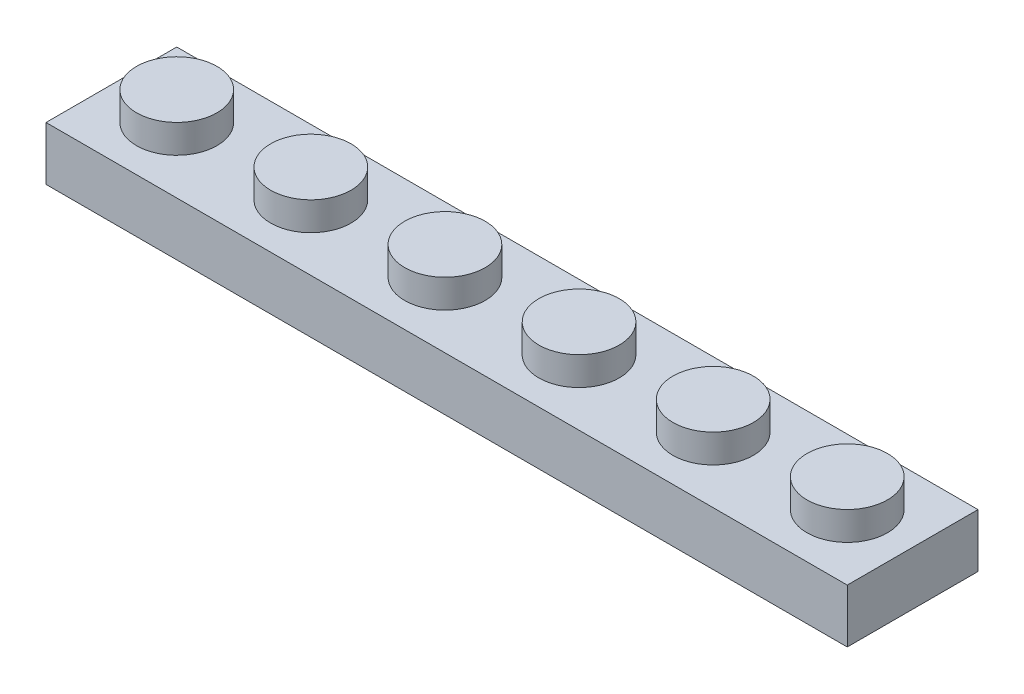
ISO-10303-21;
HEADER;
FILE_DESCRIPTION(('STEP AP214'),'2;1');
FILE_NAME('part.step','',(''),(''),'','','');
FILE_SCHEMA(('AUTOMOTIVE_DESIGN { 1 0 10303 214 1 1 1 1 }'));
ENDSEC;
DATA;
#1=APPLICATION_CONTEXT('core data for automotive mechanical design processes');
#2=APPLICATION_PROTOCOL_DEFINITION('international standard','automotive_design',2000,#1);
#3=PRODUCT_CONTEXT('',#1,'mechanical');
#4=PRODUCT('Part','Part','',(#3));
#5=PRODUCT_RELATED_PRODUCT_CATEGORY('part','',(#4));
#6=PRODUCT_DEFINITION_FORMATION('','',#4);
#7=PRODUCT_DEFINITION_CONTEXT('part definition',#1,'design');
#8=PRODUCT_DEFINITION('design','',#6,#7);
#9=PRODUCT_DEFINITION_SHAPE('','',#8);
#10=(LENGTH_UNIT() NAMED_UNIT(*) SI_UNIT(.MILLI.,.METRE.));
#11=(NAMED_UNIT(*) PLANE_ANGLE_UNIT() SI_UNIT($,.RADIAN.));
#12=(NAMED_UNIT(*) SI_UNIT($,.STERADIAN.) SOLID_ANGLE_UNIT());
#13=UNCERTAINTY_MEASURE_WITH_UNIT(LENGTH_MEASURE(1.E-05),#10,'distance_accuracy_value','');
#14=(GEOMETRIC_REPRESENTATION_CONTEXT(3) GLOBAL_UNCERTAINTY_ASSIGNED_CONTEXT((#13)) GLOBAL_UNIT_ASSIGNED_CONTEXT((#10,
#11,#12)) REPRESENTATION_CONTEXT('',''));
#15=CARTESIAN_POINT('',(0.,0.,0.));
#16=DIRECTION('',(0.,0.,1.));
#17=DIRECTION('',(1.,0.,0.));
#18=AXIS2_PLACEMENT_3D('',#15,#16,#17);
#19=CARTESIAN_POINT('',(-23.9,3.2,3.9));
#20=DIRECTION('',(1.,0.,0.));
#21=DIRECTION('',(0.,0.,-1.));
#22=AXIS2_PLACEMENT_3D('',#19,#20,#21);
#23=PLANE('',#22);
#24=DIRECTION('',(0.,0.,1.));
#25=VECTOR('',#24,1.);
#26=CARTESIAN_POINT('',(-23.9,0.,3.9));
#27=LINE('',#26,#25);
#28=CARTESIAN_POINT('',(-23.9,0.,-3.9));
#29=VERTEX_POINT('',#28);
#30=CARTESIAN_POINT('',(-23.9,0.,3.9));
#31=VERTEX_POINT('',#30);
#32=EDGE_CURVE('E96',#29,#31,#27,.T.);
#33=ORIENTED_EDGE('',*,*,#32,.T.);
#34=DIRECTION('',(0.,-1.,0.));
#35=VECTOR('',#34,1.);
#36=CARTESIAN_POINT('',(-23.9,3.2,3.9));
#37=LINE('',#36,#35);
#38=CARTESIAN_POINT('',(-23.9,3.2,3.9));
#39=VERTEX_POINT('',#38);
#40=EDGE_CURVE('E11',#39,#31,#37,.T.);
#41=ORIENTED_EDGE('',*,*,#40,.F.);
#42=DIRECTION('',(0.,0.,1.));
#43=VECTOR('',#42,1.);
#44=CARTESIAN_POINT('',(-23.9,3.2,3.9));
#45=LINE('',#44,#43);
#46=CARTESIAN_POINT('',(-23.9,3.2,-3.9));
#47=VERTEX_POINT('',#46);
#48=EDGE_CURVE('E84',#47,#39,#45,.T.);
#49=ORIENTED_EDGE('',*,*,#48,.F.);
#50=DIRECTION('',(0.,-1.,0.));
#51=VECTOR('',#50,1.);
#52=CARTESIAN_POINT('',(-23.9,3.2,-3.9));
#53=LINE('',#52,#51);
#54=EDGE_CURVE('E92',#47,#29,#53,.T.);
#55=ORIENTED_EDGE('',*,*,#54,.T.);
#56=EDGE_LOOP('',(#33,#41,#49,#55));
#57=FACE_BOUND('',#56,.T.);
#58=ADVANCED_FACE('F33',(#57),#23,.F.);
#59=CARTESIAN_POINT('',(23.9,3.2,3.9));
#60=DIRECTION('',(0.,0.,-1.));
#61=DIRECTION('',(-1.,0.,0.));
#62=AXIS2_PLACEMENT_3D('',#59,#60,#61);
#63=PLANE('',#62);
#64=DIRECTION('',(1.,0.,0.));
#65=VECTOR('',#64,1.);
#66=CARTESIAN_POINT('',(23.9,0.,3.9));
#67=LINE('',#66,#65);
#68=CARTESIAN_POINT('',(23.9,0.,3.9));
#69=VERTEX_POINT('',#68);
#70=EDGE_CURVE('E88',#31,#69,#67,.T.);
#71=ORIENTED_EDGE('',*,*,#70,.T.);
#72=DIRECTION('',(0.,-1.,0.));
#73=VECTOR('',#72,1.);
#74=CARTESIAN_POINT('',(23.9,3.2,3.9));
#75=LINE('',#74,#73);
#76=CARTESIAN_POINT('',(23.9,3.2,3.9));
#77=VERTEX_POINT('',#76);
#78=EDGE_CURVE('E41',#77,#69,#75,.T.);
#79=ORIENTED_EDGE('',*,*,#78,.F.);
#80=DIRECTION('',(1.,0.,0.));
#81=VECTOR('',#80,1.);
#82=CARTESIAN_POINT('',(23.9,3.2,3.9));
#83=LINE('',#82,#81);
#84=EDGE_CURVE('E79',#39,#77,#83,.T.);
#85=ORIENTED_EDGE('',*,*,#84,.F.);
#86=ORIENTED_EDGE('',*,*,#40,.T.);
#87=EDGE_LOOP('',(#71,#79,#85,#86));
#88=FACE_BOUND('',#87,.T.);
#89=ADVANCED_FACE('F87',(#88),#63,.F.);
#90=CARTESIAN_POINT('',(23.9,3.2,3.9));
#91=DIRECTION('',(-1.,0.,0.));
#92=DIRECTION('',(0.,0.,1.));
#93=AXIS2_PLACEMENT_3D('',#90,#91,#92);
#94=PLANE('',#93);
#95=DIRECTION('',(0.,0.,-1.));
#96=VECTOR('',#95,1.);
#97=CARTESIAN_POINT('',(23.9,0.,3.9));
#98=LINE('',#97,#96);
#99=CARTESIAN_POINT('',(23.9,0.,-3.90000000000001));
#100=VERTEX_POINT('',#99);
#101=EDGE_CURVE('E66',#69,#100,#98,.T.);
#102=ORIENTED_EDGE('',*,*,#101,.T.);
#103=DIRECTION('',(0.,-1.,0.));
#104=VECTOR('',#103,1.);
#105=CARTESIAN_POINT('',(23.9,3.2,-3.90000000000001));
#106=LINE('',#105,#104);
#107=CARTESIAN_POINT('',(23.9,3.2,-3.90000000000001));
#108=VERTEX_POINT('',#107);
#109=EDGE_CURVE('E89',#108,#100,#106,.T.);
#110=ORIENTED_EDGE('',*,*,#109,.F.);
#111=DIRECTION('',(0.,0.,-1.));
#112=VECTOR('',#111,1.);
#113=CARTESIAN_POINT('',(23.9,3.2,3.9));
#114=LINE('',#113,#112);
#115=EDGE_CURVE('E82',#77,#108,#114,.T.);
#116=ORIENTED_EDGE('',*,*,#115,.F.);
#117=ORIENTED_EDGE('',*,*,#78,.T.);
#118=EDGE_LOOP('',(#102,#110,#116,#117));
#119=FACE_BOUND('',#118,.T.);
#120=ADVANCED_FACE('F90',(#119),#94,.F.);
#121=CARTESIAN_POINT('',(23.9,3.2,-3.90000000000001));
#122=DIRECTION('',(0.,0.,1.));
#123=DIRECTION('',(1.,0.,0.));
#124=AXIS2_PLACEMENT_3D('',#121,#122,#123);
#125=PLANE('',#124);
#126=DIRECTION('',(-1.,0.,0.));
#127=VECTOR('',#126,1.);
#128=CARTESIAN_POINT('',(23.9,0.,-3.90000000000001));
#129=LINE('',#128,#127);
#130=EDGE_CURVE('E72',#100,#29,#129,.T.);
#131=ORIENTED_EDGE('',*,*,#130,.T.);
#132=ORIENTED_EDGE('',*,*,#54,.F.);
#133=DIRECTION('',(-1.,0.,0.));
#134=VECTOR('',#133,1.);
#135=CARTESIAN_POINT('',(23.9,3.2,-3.90000000000001));
#136=LINE('',#135,#134);
#137=EDGE_CURVE('E49',#108,#47,#136,.T.);
#138=ORIENTED_EDGE('',*,*,#137,.F.);
#139=ORIENTED_EDGE('',*,*,#109,.T.);
#140=EDGE_LOOP('',(#131,#132,#138,#139));
#141=FACE_BOUND('',#140,.T.);
#142=ADVANCED_FACE('F104',(#141),#125,.F.);
#143=CARTESIAN_POINT('',(0.,3.2,0.));
#144=DIRECTION('',(0.,1.,0.));
#145=DIRECTION('',(0.,0.,1.));
#146=AXIS2_PLACEMENT_3D('',#143,#144,#145);
#147=PLANE('',#146);
#148=CARTESIAN_POINT('',(20.,3.2,0.));
#149=DIRECTION('',(0.,1.,0.));
#150=DIRECTION('',(0.,0.,1.));
#151=AXIS2_PLACEMENT_3D('',#148,#149,#150);
#152=CIRCLE('',#151,2.4);
#153=CARTESIAN_POINT('',(20.,3.2,2.39999999999999));
#154=VERTEX_POINT('',#153);
#155=EDGE_CURVE('E140',#154,#154,#152,.T.);
#156=ORIENTED_EDGE('',*,*,#155,.F.);
#157=EDGE_LOOP('',(#156));
#158=FACE_BOUND('',#157,.T.);
#159=CARTESIAN_POINT('',(12.,3.2,0.));
#160=DIRECTION('',(0.,1.,0.));
#161=DIRECTION('',(0.,0.,1.));
#162=AXIS2_PLACEMENT_3D('',#159,#160,#161);
#163=CIRCLE('',#162,2.4);
#164=CARTESIAN_POINT('',(12.,3.2,2.39999999999999));
#165=VERTEX_POINT('',#164);
#166=EDGE_CURVE('E134',#165,#165,#163,.T.);
#167=ORIENTED_EDGE('',*,*,#166,.F.);
#168=EDGE_LOOP('',(#167));
#169=FACE_BOUND('',#168,.T.);
#170=CARTESIAN_POINT('',(4.00000000000001,3.2,0.));
#171=DIRECTION('',(0.,1.,0.));
#172=DIRECTION('',(0.,0.,1.));
#173=AXIS2_PLACEMENT_3D('',#170,#171,#172);
#174=CIRCLE('',#173,2.4);
#175=CARTESIAN_POINT('',(4.00000000000001,3.2,2.39999999999999));
#176=VERTEX_POINT('',#175);
#177=EDGE_CURVE('E128',#176,#176,#174,.T.);
#178=ORIENTED_EDGE('',*,*,#177,.F.);
#179=EDGE_LOOP('',(#178));
#180=FACE_BOUND('',#179,.T.);
#181=CARTESIAN_POINT('',(-3.99999999999999,3.2,0.));
#182=DIRECTION('',(0.,1.,0.));
#183=DIRECTION('',(0.,0.,1.));
#184=AXIS2_PLACEMENT_3D('',#181,#182,#183);
#185=CIRCLE('',#184,2.4);
#186=CARTESIAN_POINT('',(-3.99999999999999,3.2,2.39999999999999));
#187=VERTEX_POINT('',#186);
#188=EDGE_CURVE('E122',#187,#187,#185,.T.);
#189=ORIENTED_EDGE('',*,*,#188,.F.);
#190=EDGE_LOOP('',(#189));
#191=FACE_BOUND('',#190,.T.);
#192=CARTESIAN_POINT('',(-12.,3.2,0.));
#193=DIRECTION('',(0.,1.,0.));
#194=DIRECTION('',(0.,0.,1.));
#195=AXIS2_PLACEMENT_3D('',#192,#193,#194);
#196=CIRCLE('',#195,2.4);
#197=CARTESIAN_POINT('',(-12.,3.2,2.39999999999999));
#198=VERTEX_POINT('',#197);
#199=EDGE_CURVE('E116',#198,#198,#196,.T.);
#200=ORIENTED_EDGE('',*,*,#199,.F.);
#201=EDGE_LOOP('',(#200));
#202=FACE_BOUND('',#201,.T.);
#203=CARTESIAN_POINT('',(-20.,3.2,0.));
#204=DIRECTION('',(0.,1.,0.));
#205=DIRECTION('',(0.,0.,1.));
#206=AXIS2_PLACEMENT_3D('',#203,#204,#205);
#207=CIRCLE('',#206,2.4);
#208=CARTESIAN_POINT('',(-20.,3.2,2.4));
#209=VERTEX_POINT('',#208);
#210=EDGE_CURVE('E110',#209,#209,#207,.T.);
#211=ORIENTED_EDGE('',*,*,#210,.F.);
#212=EDGE_LOOP('',(#211));
#213=FACE_BOUND('',#212,.T.);
#214=ORIENTED_EDGE('',*,*,#48,.T.);
#215=ORIENTED_EDGE('',*,*,#84,.T.);
#216=ORIENTED_EDGE('',*,*,#115,.T.);
#217=ORIENTED_EDGE('',*,*,#137,.T.);
#218=EDGE_LOOP('',(#214,#215,#216,#217));
#219=FACE_BOUND('',#218,.T.);
#220=ADVANCED_FACE('F80',(#158,#169,#180,#191,#202,#213,#219),#147,.T.);
#221=CARTESIAN_POINT('',(0.,0.,0.));
#222=DIRECTION('',(0.,1.,0.));
#223=DIRECTION('',(0.,0.,1.));
#224=AXIS2_PLACEMENT_3D('',#221,#222,#223);
#225=PLANE('',#224);
#226=CARTESIAN_POINT('',(-20.,0.,0.));
#227=DIRECTION('',(0.,-1.,0.));
#228=DIRECTION('',(0.,0.,-1.));
#229=AXIS2_PLACEMENT_3D('',#226,#227,#228);
#230=CIRCLE('',#229,2.5);
#231=CARTESIAN_POINT('',(-20.,0.,-2.5));
#232=VERTEX_POINT('',#231);
#233=EDGE_CURVE('E176',#232,#232,#230,.T.);
#234=ORIENTED_EDGE('',*,*,#233,.F.);
#235=EDGE_LOOP('',(#234));
#236=FACE_BOUND('',#235,.T.);
#237=CARTESIAN_POINT('',(-12.,0.,0.));
#238=DIRECTION('',(0.,-1.,0.));
#239=DIRECTION('',(0.,0.,-1.));
#240=AXIS2_PLACEMENT_3D('',#237,#238,#239);
#241=CIRCLE('',#240,2.5);
#242=CARTESIAN_POINT('',(-12.,0.,-2.5));
#243=VERTEX_POINT('',#242);
#244=EDGE_CURVE('E170',#243,#243,#241,.T.);
#245=ORIENTED_EDGE('',*,*,#244,.F.);
#246=EDGE_LOOP('',(#245));
#247=FACE_BOUND('',#246,.T.);
#248=CARTESIAN_POINT('',(-3.99999999999999,0.,0.));
#249=DIRECTION('',(0.,-1.,0.));
#250=DIRECTION('',(0.,0.,-1.));
#251=AXIS2_PLACEMENT_3D('',#248,#249,#250);
#252=CIRCLE('',#251,2.5);
#253=CARTESIAN_POINT('',(-3.99999999999999,0.,-2.5));
#254=VERTEX_POINT('',#253);
#255=EDGE_CURVE('E164',#254,#254,#252,.T.);
#256=ORIENTED_EDGE('',*,*,#255,.F.);
#257=EDGE_LOOP('',(#256));
#258=FACE_BOUND('',#257,.T.);
#259=CARTESIAN_POINT('',(4.00000000000001,0.,0.));
#260=DIRECTION('',(0.,-1.,0.));
#261=DIRECTION('',(0.,0.,-1.));
#262=AXIS2_PLACEMENT_3D('',#259,#260,#261);
#263=CIRCLE('',#262,2.5);
#264=CARTESIAN_POINT('',(4.00000000000001,0.,-2.5));
#265=VERTEX_POINT('',#264);
#266=EDGE_CURVE('E158',#265,#265,#263,.T.);
#267=ORIENTED_EDGE('',*,*,#266,.F.);
#268=EDGE_LOOP('',(#267));
#269=FACE_BOUND('',#268,.T.);
#270=CARTESIAN_POINT('',(12.,0.,0.));
#271=DIRECTION('',(0.,-1.,0.));
#272=DIRECTION('',(0.,0.,-1.));
#273=AXIS2_PLACEMENT_3D('',#270,#271,#272);
#274=CIRCLE('',#273,2.5);
#275=CARTESIAN_POINT('',(12.,0.,-2.5));
#276=VERTEX_POINT('',#275);
#277=EDGE_CURVE('E152',#276,#276,#274,.T.);
#278=ORIENTED_EDGE('',*,*,#277,.F.);
#279=EDGE_LOOP('',(#278));
#280=FACE_BOUND('',#279,.T.);
#281=CARTESIAN_POINT('',(20.,0.,0.));
#282=DIRECTION('',(0.,-1.,0.));
#283=DIRECTION('',(0.,0.,-1.));
#284=AXIS2_PLACEMENT_3D('',#281,#282,#283);
#285=CIRCLE('',#284,2.5);
#286=CARTESIAN_POINT('',(20.,0.,-2.5));
#287=VERTEX_POINT('',#286);
#288=EDGE_CURVE('E146',#287,#287,#285,.T.);
#289=ORIENTED_EDGE('',*,*,#288,.F.);
#290=EDGE_LOOP('',(#289));
#291=FACE_BOUND('',#290,.T.);
#292=ORIENTED_EDGE('',*,*,#32,.F.);
#293=ORIENTED_EDGE('',*,*,#130,.F.);
#294=ORIENTED_EDGE('',*,*,#101,.F.);
#295=ORIENTED_EDGE('',*,*,#70,.F.);
#296=EDGE_LOOP('',(#292,#293,#294,#295));
#297=FACE_BOUND('',#296,.T.);
#298=ADVANCED_FACE('F107',(#236,#247,#258,#269,#280,#291,#297),#225,.F.);
#299=CARTESIAN_POINT('',(-20.,4.9,0.));
#300=DIRECTION('',(0.,-1.,0.));
#301=DIRECTION('',(0.,0.,-1.));
#302=AXIS2_PLACEMENT_3D('',#299,#300,#301);
#303=CYLINDRICAL_SURFACE('',#302,2.4);
#304=CARTESIAN_POINT('',(-20.,4.9,0.));
#305=DIRECTION('',(0.,1.,0.));
#306=DIRECTION('',(0.,0.,1.));
#307=AXIS2_PLACEMENT_3D('',#304,#305,#306);
#308=CIRCLE('',#307,2.4);
#309=CARTESIAN_POINT('',(-20.,4.9,2.4));
#310=VERTEX_POINT('',#309);
#311=EDGE_CURVE('E99',#310,#310,#308,.T.);
#312=ORIENTED_EDGE('',*,*,#311,.F.);
#313=EDGE_LOOP('',(#312));
#314=FACE_BOUND('',#313,.T.);
#315=ORIENTED_EDGE('',*,*,#210,.T.);
#316=EDGE_LOOP('',(#315));
#317=FACE_BOUND('',#316,.T.);
#318=ADVANCED_FACE('F193',(#314,#317),#303,.T.);
#319=CARTESIAN_POINT('',(-20.,4.9,0.));
#320=DIRECTION('',(0.,1.,0.));
#321=DIRECTION('',(0.,0.,1.));
#322=AXIS2_PLACEMENT_3D('',#319,#320,#321);
#323=PLANE('',#322);
#324=ORIENTED_EDGE('',*,*,#311,.T.);
#325=EDGE_LOOP('',(#324));
#326=FACE_BOUND('',#325,.T.);
#327=ADVANCED_FACE('F238',(#326),#323,.T.);
#328=CARTESIAN_POINT('',(-12.,4.9,0.));
#329=DIRECTION('',(0.,-1.,0.));
#330=DIRECTION('',(0.,0.,-1.));
#331=AXIS2_PLACEMENT_3D('',#328,#329,#330);
#332=CYLINDRICAL_SURFACE('',#331,2.4);
#333=CARTESIAN_POINT('',(-12.,4.9,0.));
#334=DIRECTION('',(0.,1.,0.));
#335=DIRECTION('',(0.,0.,1.));
#336=AXIS2_PLACEMENT_3D('',#333,#334,#335);
#337=CIRCLE('',#336,2.4);
#338=CARTESIAN_POINT('',(-12.,4.9,2.39999999999999));
#339=VERTEX_POINT('',#338);
#340=EDGE_CURVE('E113',#339,#339,#337,.T.);
#341=ORIENTED_EDGE('',*,*,#340,.F.);
#342=EDGE_LOOP('',(#341));
#343=FACE_BOUND('',#342,.T.);
#344=ORIENTED_EDGE('',*,*,#199,.T.);
#345=EDGE_LOOP('',(#344));
#346=FACE_BOUND('',#345,.T.);
#347=ADVANCED_FACE('F242',(#343,#346),#332,.T.);
#348=CARTESIAN_POINT('',(-12.,4.9,0.));
#349=DIRECTION('',(0.,1.,0.));
#350=DIRECTION('',(0.,0.,1.));
#351=AXIS2_PLACEMENT_3D('',#348,#349,#350);
#352=PLANE('',#351);
#353=ORIENTED_EDGE('',*,*,#340,.T.);
#354=EDGE_LOOP('',(#353));
#355=FACE_BOUND('',#354,.T.);
#356=ADVANCED_FACE('F246',(#355),#352,.T.);
#357=CARTESIAN_POINT('',(-3.99999999999999,4.9,0.));
#358=DIRECTION('',(0.,-1.,0.));
#359=DIRECTION('',(0.,0.,-1.));
#360=AXIS2_PLACEMENT_3D('',#357,#358,#359);
#361=CYLINDRICAL_SURFACE('',#360,2.4);
#362=CARTESIAN_POINT('',(-3.99999999999999,4.9,0.));
#363=DIRECTION('',(0.,1.,0.));
#364=DIRECTION('',(0.,0.,1.));
#365=AXIS2_PLACEMENT_3D('',#362,#363,#364);
#366=CIRCLE('',#365,2.4);
#367=CARTESIAN_POINT('',(-3.99999999999999,4.9,2.39999999999999));
#368=VERTEX_POINT('',#367);
#369=EDGE_CURVE('E119',#368,#368,#366,.T.);
#370=ORIENTED_EDGE('',*,*,#369,.F.);
#371=EDGE_LOOP('',(#370));
#372=FACE_BOUND('',#371,.T.);
#373=ORIENTED_EDGE('',*,*,#188,.T.);
#374=EDGE_LOOP('',(#373));
#375=FACE_BOUND('',#374,.T.);
#376=ADVANCED_FACE('F250',(#372,#375),#361,.T.);
#377=CARTESIAN_POINT('',(-3.99999999999999,4.9,0.));
#378=DIRECTION('',(0.,1.,0.));
#379=DIRECTION('',(0.,0.,1.));
#380=AXIS2_PLACEMENT_3D('',#377,#378,#379);
#381=PLANE('',#380);
#382=ORIENTED_EDGE('',*,*,#369,.T.);
#383=EDGE_LOOP('',(#382));
#384=FACE_BOUND('',#383,.T.);
#385=ADVANCED_FACE('F254',(#384),#381,.T.);
#386=CARTESIAN_POINT('',(4.00000000000001,4.9,0.));
#387=DIRECTION('',(0.,-1.,0.));
#388=DIRECTION('',(0.,0.,-1.));
#389=AXIS2_PLACEMENT_3D('',#386,#387,#388);
#390=CYLINDRICAL_SURFACE('',#389,2.4);
#391=CARTESIAN_POINT('',(4.00000000000001,4.9,0.));
#392=DIRECTION('',(0.,1.,0.));
#393=DIRECTION('',(0.,0.,1.));
#394=AXIS2_PLACEMENT_3D('',#391,#392,#393);
#395=CIRCLE('',#394,2.4);
#396=CARTESIAN_POINT('',(4.00000000000001,4.9,2.39999999999999));
#397=VERTEX_POINT('',#396);
#398=EDGE_CURVE('E125',#397,#397,#395,.T.);
#399=ORIENTED_EDGE('',*,*,#398,.F.);
#400=EDGE_LOOP('',(#399));
#401=FACE_BOUND('',#400,.T.);
#402=ORIENTED_EDGE('',*,*,#177,.T.);
#403=EDGE_LOOP('',(#402));
#404=FACE_BOUND('',#403,.T.);
#405=ADVANCED_FACE('F258',(#401,#404),#390,.T.);
#406=CARTESIAN_POINT('',(4.00000000000001,4.9,0.));
#407=DIRECTION('',(0.,1.,0.));
#408=DIRECTION('',(0.,0.,1.));
#409=AXIS2_PLACEMENT_3D('',#406,#407,#408);
#410=PLANE('',#409);
#411=ORIENTED_EDGE('',*,*,#398,.T.);
#412=EDGE_LOOP('',(#411));
#413=FACE_BOUND('',#412,.T.);
#414=ADVANCED_FACE('F262',(#413),#410,.T.);
#415=CARTESIAN_POINT('',(12.,4.9,0.));
#416=DIRECTION('',(0.,-1.,0.));
#417=DIRECTION('',(0.,0.,-1.));
#418=AXIS2_PLACEMENT_3D('',#415,#416,#417);
#419=CYLINDRICAL_SURFACE('',#418,2.4);
#420=CARTESIAN_POINT('',(12.,4.9,0.));
#421=DIRECTION('',(0.,1.,0.));
#422=DIRECTION('',(0.,0.,1.));
#423=AXIS2_PLACEMENT_3D('',#420,#421,#422);
#424=CIRCLE('',#423,2.4);
#425=CARTESIAN_POINT('',(12.,4.9,2.39999999999999));
#426=VERTEX_POINT('',#425);
#427=EDGE_CURVE('E131',#426,#426,#424,.T.);
#428=ORIENTED_EDGE('',*,*,#427,.F.);
#429=EDGE_LOOP('',(#428));
#430=FACE_BOUND('',#429,.T.);
#431=ORIENTED_EDGE('',*,*,#166,.T.);
#432=EDGE_LOOP('',(#431));
#433=FACE_BOUND('',#432,.T.);
#434=ADVANCED_FACE('F266',(#430,#433),#419,.T.);
#435=CARTESIAN_POINT('',(12.,4.9,0.));
#436=DIRECTION('',(0.,1.,0.));
#437=DIRECTION('',(0.,0.,1.));
#438=AXIS2_PLACEMENT_3D('',#435,#436,#437);
#439=PLANE('',#438);
#440=ORIENTED_EDGE('',*,*,#427,.T.);
#441=EDGE_LOOP('',(#440));
#442=FACE_BOUND('',#441,.T.);
#443=ADVANCED_FACE('F270',(#442),#439,.T.);
#444=CARTESIAN_POINT('',(20.,4.9,0.));
#445=DIRECTION('',(0.,-1.,0.));
#446=DIRECTION('',(0.,0.,-1.));
#447=AXIS2_PLACEMENT_3D('',#444,#445,#446);
#448=CYLINDRICAL_SURFACE('',#447,2.4);
#449=CARTESIAN_POINT('',(20.,4.9,0.));
#450=DIRECTION('',(0.,1.,0.));
#451=DIRECTION('',(0.,0.,1.));
#452=AXIS2_PLACEMENT_3D('',#449,#450,#451);
#453=CIRCLE('',#452,2.4);
#454=CARTESIAN_POINT('',(20.,4.9,2.39999999999999));
#455=VERTEX_POINT('',#454);
#456=EDGE_CURVE('E137',#455,#455,#453,.T.);
#457=ORIENTED_EDGE('',*,*,#456,.F.);
#458=EDGE_LOOP('',(#457));
#459=FACE_BOUND('',#458,.T.);
#460=ORIENTED_EDGE('',*,*,#155,.T.);
#461=EDGE_LOOP('',(#460));
#462=FACE_BOUND('',#461,.T.);
#463=ADVANCED_FACE('F218',(#459,#462),#448,.T.);
#464=CARTESIAN_POINT('',(20.,4.9,0.));
#465=DIRECTION('',(0.,1.,0.));
#466=DIRECTION('',(0.,0.,1.));
#467=AXIS2_PLACEMENT_3D('',#464,#465,#466);
#468=PLANE('',#467);
#469=ORIENTED_EDGE('',*,*,#456,.T.);
#470=EDGE_LOOP('',(#469));
#471=FACE_BOUND('',#470,.T.);
#472=ADVANCED_FACE('F208',(#471),#468,.T.);
#473=CARTESIAN_POINT('',(20.,1.8,0.));
#474=DIRECTION('',(0.,-1.,0.));
#475=DIRECTION('',(0.,0.,-1.));
#476=AXIS2_PLACEMENT_3D('',#473,#474,#475);
#477=CYLINDRICAL_SURFACE('',#476,2.5);
#478=CARTESIAN_POINT('',(20.,1.8,0.));
#479=DIRECTION('',(0.,-1.,0.));
#480=DIRECTION('',(0.,0.,-1.));
#481=AXIS2_PLACEMENT_3D('',#478,#479,#480);
#482=CIRCLE('',#481,2.5);
#483=CARTESIAN_POINT('',(20.,1.8,-2.5));
#484=VERTEX_POINT('',#483);
#485=EDGE_CURVE('E149',#484,#484,#482,.T.);
#486=ORIENTED_EDGE('',*,*,#485,.F.);
#487=EDGE_LOOP('',(#486));
#488=FACE_BOUND('',#487,.T.);
#489=ORIENTED_EDGE('',*,*,#288,.T.);
#490=EDGE_LOOP('',(#489));
#491=FACE_BOUND('',#490,.T.);
#492=ADVANCED_FACE('F205',(#488,#491),#477,.F.);
#493=CARTESIAN_POINT('',(20.,1.8,0.));
#494=DIRECTION('',(0.,-1.,0.));
#495=DIRECTION('',(0.,0.,-1.));
#496=AXIS2_PLACEMENT_3D('',#493,#494,#495);
#497=PLANE('',#496);
#498=ORIENTED_EDGE('',*,*,#485,.T.);
#499=EDGE_LOOP('',(#498));
#500=FACE_BOUND('',#499,.T.);
#501=ADVANCED_FACE('F207',(#500),#497,.T.);
#502=CARTESIAN_POINT('',(12.,1.8,0.));
#503=DIRECTION('',(0.,-1.,0.));
#504=DIRECTION('',(0.,0.,-1.));
#505=AXIS2_PLACEMENT_3D('',#502,#503,#504);
#506=CYLINDRICAL_SURFACE('',#505,2.5);
#507=CARTESIAN_POINT('',(12.,1.8,0.));
#508=DIRECTION('',(0.,-1.,0.));
#509=DIRECTION('',(0.,0.,-1.));
#510=AXIS2_PLACEMENT_3D('',#507,#508,#509);
#511=CIRCLE('',#510,2.5);
#512=CARTESIAN_POINT('',(12.,1.8,-2.5));
#513=VERTEX_POINT('',#512);
#514=EDGE_CURVE('E155',#513,#513,#511,.T.);
#515=ORIENTED_EDGE('',*,*,#514,.F.);
#516=EDGE_LOOP('',(#515));
#517=FACE_BOUND('',#516,.T.);
#518=ORIENTED_EDGE('',*,*,#277,.T.);
#519=EDGE_LOOP('',(#518));
#520=FACE_BOUND('',#519,.T.);
#521=ADVANCED_FACE('F215',(#517,#520),#506,.F.);
#522=CARTESIAN_POINT('',(12.,1.8,0.));
#523=DIRECTION('',(0.,-1.,0.));
#524=DIRECTION('',(0.,0.,-1.));
#525=AXIS2_PLACEMENT_3D('',#522,#523,#524);
#526=PLANE('',#525);
#527=ORIENTED_EDGE('',*,*,#514,.T.);
#528=EDGE_LOOP('',(#527));
#529=FACE_BOUND('',#528,.T.);
#530=ADVANCED_FACE('F330',(#529),#526,.T.);
#531=CARTESIAN_POINT('',(4.00000000000001,1.8,0.));
#532=DIRECTION('',(0.,-1.,0.));
#533=DIRECTION('',(0.,0.,-1.));
#534=AXIS2_PLACEMENT_3D('',#531,#532,#533);
#535=CYLINDRICAL_SURFACE('',#534,2.5);
#536=CARTESIAN_POINT('',(4.00000000000001,1.8,0.));
#537=DIRECTION('',(0.,-1.,0.));
#538=DIRECTION('',(0.,0.,-1.));
#539=AXIS2_PLACEMENT_3D('',#536,#537,#538);
#540=CIRCLE('',#539,2.5);
#541=CARTESIAN_POINT('',(4.00000000000001,1.8,-2.5));
#542=VERTEX_POINT('',#541);
#543=EDGE_CURVE('E161',#542,#542,#540,.T.);
#544=ORIENTED_EDGE('',*,*,#543,.F.);
#545=EDGE_LOOP('',(#544));
#546=FACE_BOUND('',#545,.T.);
#547=ORIENTED_EDGE('',*,*,#266,.T.);
#548=EDGE_LOOP('',(#547));
#549=FACE_BOUND('',#548,.T.);
#550=ADVANCED_FACE('F340',(#546,#549),#535,.F.);
#551=CARTESIAN_POINT('',(4.00000000000001,1.8,0.));
#552=DIRECTION('',(0.,-1.,0.));
#553=DIRECTION('',(0.,0.,-1.));
#554=AXIS2_PLACEMENT_3D('',#551,#552,#553);
#555=PLANE('',#554);
#556=ORIENTED_EDGE('',*,*,#543,.T.);
#557=EDGE_LOOP('',(#556));
#558=FACE_BOUND('',#557,.T.);
#559=ADVANCED_FACE('F350',(#558),#555,.T.);
#560=CARTESIAN_POINT('',(-3.99999999999999,1.8,0.));
#561=DIRECTION('',(0.,-1.,0.));
#562=DIRECTION('',(0.,0.,-1.));
#563=AXIS2_PLACEMENT_3D('',#560,#561,#562);
#564=CYLINDRICAL_SURFACE('',#563,2.5);
#565=CARTESIAN_POINT('',(-3.99999999999999,1.8,0.));
#566=DIRECTION('',(0.,-1.,0.));
#567=DIRECTION('',(0.,0.,-1.));
#568=AXIS2_PLACEMENT_3D('',#565,#566,#567);
#569=CIRCLE('',#568,2.5);
#570=CARTESIAN_POINT('',(-3.99999999999999,1.8,-2.5));
#571=VERTEX_POINT('',#570);
#572=EDGE_CURVE('E167',#571,#571,#569,.T.);
#573=ORIENTED_EDGE('',*,*,#572,.F.);
#574=EDGE_LOOP('',(#573));
#575=FACE_BOUND('',#574,.T.);
#576=ORIENTED_EDGE('',*,*,#255,.T.);
#577=EDGE_LOOP('',(#576));
#578=FACE_BOUND('',#577,.T.);
#579=ADVANCED_FACE('F360',(#575,#578),#564,.F.);
#580=CARTESIAN_POINT('',(-3.99999999999999,1.8,0.));
#581=DIRECTION('',(0.,-1.,0.));
#582=DIRECTION('',(0.,0.,-1.));
#583=AXIS2_PLACEMENT_3D('',#580,#581,#582);
#584=PLANE('',#583);
#585=ORIENTED_EDGE('',*,*,#572,.T.);
#586=EDGE_LOOP('',(#585));
#587=FACE_BOUND('',#586,.T.);
#588=ADVANCED_FACE('F370',(#587),#584,.T.);
#589=CARTESIAN_POINT('',(-12.,1.8,0.));
#590=DIRECTION('',(0.,-1.,0.));
#591=DIRECTION('',(0.,0.,-1.));
#592=AXIS2_PLACEMENT_3D('',#589,#590,#591);
#593=CYLINDRICAL_SURFACE('',#592,2.5);
#594=CARTESIAN_POINT('',(-12.,1.8,0.));
#595=DIRECTION('',(0.,-1.,0.));
#596=DIRECTION('',(0.,0.,-1.));
#597=AXIS2_PLACEMENT_3D('',#594,#595,#596);
#598=CIRCLE('',#597,2.5);
#599=CARTESIAN_POINT('',(-12.,1.8,-2.5));
#600=VERTEX_POINT('',#599);
#601=EDGE_CURVE('E173',#600,#600,#598,.T.);
#602=ORIENTED_EDGE('',*,*,#601,.F.);
#603=EDGE_LOOP('',(#602));
#604=FACE_BOUND('',#603,.T.);
#605=ORIENTED_EDGE('',*,*,#244,.T.);
#606=EDGE_LOOP('',(#605));
#607=FACE_BOUND('',#606,.T.);
#608=ADVANCED_FACE('F380',(#604,#607),#593,.F.);
#609=CARTESIAN_POINT('',(-12.,1.8,0.));
#610=DIRECTION('',(0.,-1.,0.));
#611=DIRECTION('',(0.,0.,-1.));
#612=AXIS2_PLACEMENT_3D('',#609,#610,#611);
#613=PLANE('',#612);
#614=ORIENTED_EDGE('',*,*,#601,.T.);
#615=EDGE_LOOP('',(#614));
#616=FACE_BOUND('',#615,.T.);
#617=ADVANCED_FACE('F187',(#616),#613,.T.);
#618=CARTESIAN_POINT('',(-20.,1.8,0.));
#619=DIRECTION('',(0.,-1.,0.));
#620=DIRECTION('',(0.,0.,-1.));
#621=AXIS2_PLACEMENT_3D('',#618,#619,#620);
#622=CYLINDRICAL_SURFACE('',#621,2.5);
#623=CARTESIAN_POINT('',(-20.,1.8,0.));
#624=DIRECTION('',(0.,-1.,0.));
#625=DIRECTION('',(0.,0.,-1.));
#626=AXIS2_PLACEMENT_3D('',#623,#624,#625);
#627=CIRCLE('',#626,2.5);
#628=CARTESIAN_POINT('',(-20.,1.8,-2.5));
#629=VERTEX_POINT('',#628);
#630=EDGE_CURVE('E143',#629,#629,#627,.T.);
#631=ORIENTED_EDGE('',*,*,#630,.F.);
#632=EDGE_LOOP('',(#631));
#633=FACE_BOUND('',#632,.T.);
#634=ORIENTED_EDGE('',*,*,#233,.T.);
#635=EDGE_LOOP('',(#634));
#636=FACE_BOUND('',#635,.T.);
#637=ADVANCED_FACE('F184',(#633,#636),#622,.F.);
#638=CARTESIAN_POINT('',(-20.,1.8,0.));
#639=DIRECTION('',(0.,-1.,0.));
#640=DIRECTION('',(0.,0.,-1.));
#641=AXIS2_PLACEMENT_3D('',#638,#639,#640);
#642=PLANE('',#641);
#643=ORIENTED_EDGE('',*,*,#630,.T.);
#644=EDGE_LOOP('',(#643));
#645=FACE_BOUND('',#644,.T.);
#646=ADVANCED_FACE('F182',(#645),#642,.T.);
#647=CLOSED_SHELL('',(#58,#89,#120,#142,#220,#298,#318,#327,#347,#356,#376,#385,#405,#414,#434,
#443,#463,#472,#492,#501,#521,#530,#550,#559,#579,#588,#608,#617,#637,#646));
#648=MANIFOLD_SOLID_BREP('B2',#647);
#649=ADVANCED_BREP_SHAPE_REPRESENTATION('',(#18,#648),#14);
#650=SHAPE_DEFINITION_REPRESENTATION(#9,#649);
ENDSEC;
END-ISO-10303-21;
